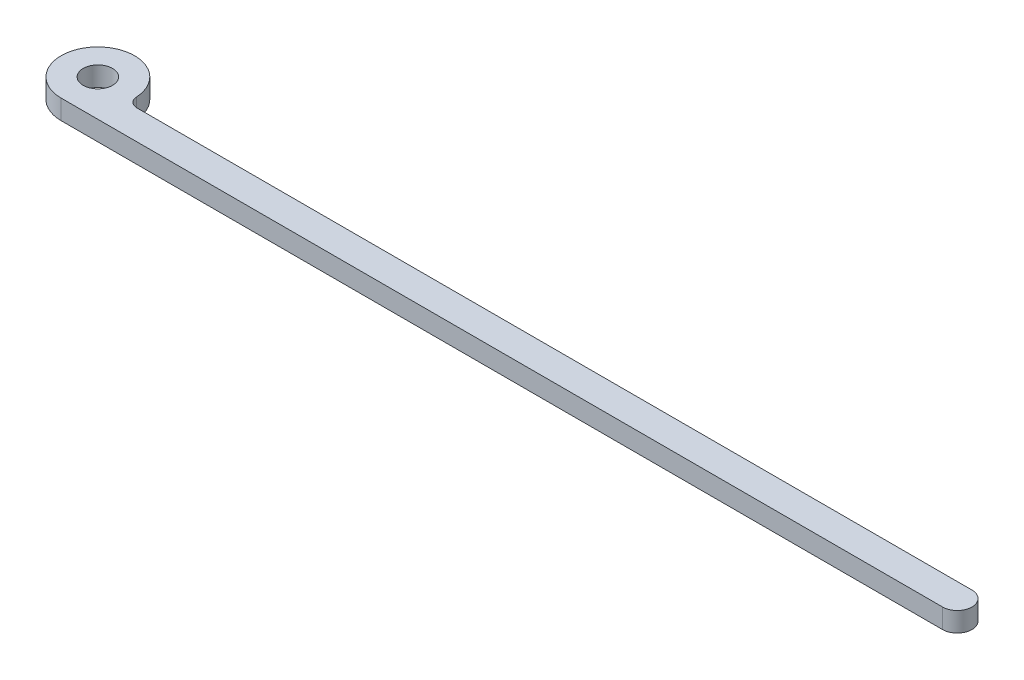
ISO-10303-21;
HEADER;
FILE_DESCRIPTION(('STEP AP214'),'2;1');
FILE_NAME('part.step','',(''),(''),'','','');
FILE_SCHEMA(('AUTOMOTIVE_DESIGN { 1 0 10303 214 1 1 1 1 }'));
ENDSEC;
DATA;
#1=APPLICATION_CONTEXT('core data for automotive mechanical design processes');
#2=APPLICATION_PROTOCOL_DEFINITION('international standard','automotive_design',2000,#1);
#3=PRODUCT_CONTEXT('',#1,'mechanical');
#4=PRODUCT('Part','Part','',(#3));
#5=PRODUCT_RELATED_PRODUCT_CATEGORY('part','',(#4));
#6=PRODUCT_DEFINITION_FORMATION('','',#4);
#7=PRODUCT_DEFINITION_CONTEXT('part definition',#1,'design');
#8=PRODUCT_DEFINITION('design','',#6,#7);
#9=PRODUCT_DEFINITION_SHAPE('','',#8);
#10=(LENGTH_UNIT() NAMED_UNIT(*) SI_UNIT(.MILLI.,.METRE.));
#11=(NAMED_UNIT(*) PLANE_ANGLE_UNIT() SI_UNIT($,.RADIAN.));
#12=(NAMED_UNIT(*) SI_UNIT($,.STERADIAN.) SOLID_ANGLE_UNIT());
#13=UNCERTAINTY_MEASURE_WITH_UNIT(LENGTH_MEASURE(1.E-05),#10,'distance_accuracy_value','');
#14=(GEOMETRIC_REPRESENTATION_CONTEXT(3) GLOBAL_UNCERTAINTY_ASSIGNED_CONTEXT((#13)) GLOBAL_UNIT_ASSIGNED_CONTEXT((#10,
#11,#12)) REPRESENTATION_CONTEXT('',''));
#15=CARTESIAN_POINT('',(0.,0.,0.));
#16=DIRECTION('',(0.,0.,1.));
#17=DIRECTION('',(1.,0.,0.));
#18=AXIS2_PLACEMENT_3D('',#15,#16,#17);
#19=CARTESIAN_POINT('',(0.,2.,0.));
#20=DIRECTION('',(0.,1.,0.));
#21=DIRECTION('',(0.,0.,1.));
#22=AXIS2_PLACEMENT_3D('',#19,#20,#21);
#23=PLANE('',#22);
#24=DIRECTION('',(-1.,0.,0.));
#25=VECTOR('',#24,1.);
#26=CARTESIAN_POINT('',(180.,2.,1.5));
#27=LINE('',#26,#25);
#28=CARTESIAN_POINT('',(180.,2.,1.5));
#29=VERTEX_POINT('',#28);
#30=CARTESIAN_POINT('',(9.48683298050512,2.,1.49999999999994));
#31=VERTEX_POINT('',#30);
#32=EDGE_CURVE('E127',#29,#31,#27,.T.);
#33=ORIENTED_EDGE('',*,*,#32,.T.);
#34=CARTESIAN_POINT('',(9.48683298050513,2.,-0.500000000000062));
#35=DIRECTION('',(0.,1.,0.));
#36=DIRECTION('',(0.,0.,1.));
#37=AXIS2_PLACEMENT_3D('',#34,#35,#36);
#38=CIRCLE('',#37,2.);
#39=CARTESIAN_POINT('',(7.48960498460932,2.,-0.394736842105312));
#40=VERTEX_POINT('',#39);
#41=EDGE_CURVE('E11',#31,#40,#38,.F.);
#42=ORIENTED_EDGE('',*,*,#41,.T.);
#43=CARTESIAN_POINT('',(0.,2.,0.));
#44=DIRECTION('',(0.,1.,0.));
#45=DIRECTION('',(0.,0.,1.));
#46=AXIS2_PLACEMENT_3D('',#43,#44,#45);
#47=CIRCLE('',#46,7.5);
#48=CARTESIAN_POINT('',(0.,2.,7.5));
#49=VERTEX_POINT('',#48);
#50=EDGE_CURVE('E86',#40,#49,#47,.T.);
#51=ORIENTED_EDGE('',*,*,#50,.T.);
#52=DIRECTION('',(1.,0.,0.));
#53=VECTOR('',#52,1.);
#54=CARTESIAN_POINT('',(0.,2.,7.5));
#55=LINE('',#54,#53);
#56=CARTESIAN_POINT('',(180.,2.,7.5));
#57=VERTEX_POINT('',#56);
#58=EDGE_CURVE('E89',#49,#57,#55,.T.);
#59=ORIENTED_EDGE('',*,*,#58,.T.);
#60=CARTESIAN_POINT('',(180.,2.,4.5));
#61=DIRECTION('',(0.,1.,0.));
#62=DIRECTION('',(0.,0.,1.));
#63=AXIS2_PLACEMENT_3D('',#60,#61,#62);
#64=CIRCLE('',#63,3.);
#65=EDGE_CURVE('E107',#57,#29,#64,.T.);
#66=ORIENTED_EDGE('',*,*,#65,.T.);
#67=EDGE_LOOP('',(#33,#42,#51,#59,#66));
#68=FACE_BOUND('',#67,.T.);
#69=CARTESIAN_POINT('',(0.,2.,0.));
#70=DIRECTION('',(0.,1.,0.));
#71=DIRECTION('',(0.,0.,1.));
#72=AXIS2_PLACEMENT_3D('',#69,#70,#71);
#73=CIRCLE('',#72,3.);
#74=CARTESIAN_POINT('',(0.,2.,3.));
#75=VERTEX_POINT('',#74);
#76=EDGE_CURVE('E138',#75,#75,#73,.T.);
#77=ORIENTED_EDGE('',*,*,#76,.F.);
#78=EDGE_LOOP('',(#77));
#79=FACE_BOUND('',#78,.T.);
#80=ADVANCED_FACE('F39',(#68,#79),#23,.T.);
#81=CARTESIAN_POINT('',(0.,-2.,0.));
#82=DIRECTION('',(0.,1.,0.));
#83=DIRECTION('',(0.,0.,1.));
#84=AXIS2_PLACEMENT_3D('',#81,#82,#83);
#85=PLANE('',#84);
#86=CARTESIAN_POINT('',(0.,-2.,0.));
#87=DIRECTION('',(0.,1.,0.));
#88=DIRECTION('',(0.,0.,1.));
#89=AXIS2_PLACEMENT_3D('',#86,#87,#88);
#90=CIRCLE('',#89,7.5);
#91=CARTESIAN_POINT('',(7.48960498460932,-2.,-0.394736842105312));
#92=VERTEX_POINT('',#91);
#93=CARTESIAN_POINT('',(0.,-2.,7.5));
#94=VERTEX_POINT('',#93);
#95=EDGE_CURVE('E110',#92,#94,#90,.T.);
#96=ORIENTED_EDGE('',*,*,#95,.F.);
#97=CARTESIAN_POINT('',(9.48683298050513,-2.,-0.500000000000062));
#98=DIRECTION('',(0.,1.,0.));
#99=DIRECTION('',(0.,0.,1.));
#100=AXIS2_PLACEMENT_3D('',#97,#98,#99);
#101=CIRCLE('',#100,2.);
#102=CARTESIAN_POINT('',(9.48683298050512,-2.,1.49999999999994));
#103=VERTEX_POINT('',#102);
#104=EDGE_CURVE('E48',#92,#103,#101,.T.);
#105=ORIENTED_EDGE('',*,*,#104,.T.);
#106=DIRECTION('',(-1.,0.,0.));
#107=VECTOR('',#106,1.);
#108=CARTESIAN_POINT('',(180.,-2.,1.5));
#109=LINE('',#108,#107);
#110=CARTESIAN_POINT('',(180.,-2.,1.5));
#111=VERTEX_POINT('',#110);
#112=EDGE_CURVE('E97',#111,#103,#109,.T.);
#113=ORIENTED_EDGE('',*,*,#112,.F.);
#114=CARTESIAN_POINT('',(180.,-2.,4.5));
#115=DIRECTION('',(0.,1.,0.));
#116=DIRECTION('',(0.,0.,1.));
#117=AXIS2_PLACEMENT_3D('',#114,#115,#116);
#118=CIRCLE('',#117,3.);
#119=CARTESIAN_POINT('',(180.,-2.,7.5));
#120=VERTEX_POINT('',#119);
#121=EDGE_CURVE('E130',#120,#111,#118,.T.);
#122=ORIENTED_EDGE('',*,*,#121,.F.);
#123=DIRECTION('',(1.,0.,0.));
#124=VECTOR('',#123,1.);
#125=CARTESIAN_POINT('',(0.,-2.,7.5));
#126=LINE('',#125,#124);
#127=EDGE_CURVE('E133',#94,#120,#126,.T.);
#128=ORIENTED_EDGE('',*,*,#127,.F.);
#129=EDGE_LOOP('',(#96,#105,#113,#122,#128));
#130=FACE_BOUND('',#129,.T.);
#131=CARTESIAN_POINT('',(0.,-2.,0.));
#132=DIRECTION('',(0.,1.,0.));
#133=DIRECTION('',(0.,0.,1.));
#134=AXIS2_PLACEMENT_3D('',#131,#132,#133);
#135=CIRCLE('',#134,3.);
#136=CARTESIAN_POINT('',(0.,-2.,3.));
#137=VERTEX_POINT('',#136);
#138=EDGE_CURVE('E143',#137,#137,#135,.T.);
#139=ORIENTED_EDGE('',*,*,#138,.T.);
#140=EDGE_LOOP('',(#139));
#141=FACE_BOUND('',#140,.T.);
#142=ADVANCED_FACE('F154',(#130,#141),#85,.F.);
#143=CARTESIAN_POINT('',(0.,2.,0.));
#144=DIRECTION('',(0.,-1.,0.));
#145=DIRECTION('',(0.,0.,-1.));
#146=AXIS2_PLACEMENT_3D('',#143,#144,#145);
#147=CYLINDRICAL_SURFACE('',#146,7.5);
#148=ORIENTED_EDGE('',*,*,#50,.F.);
#149=DIRECTION('',(0.,-1.,0.));
#150=VECTOR('',#149,1.);
#151=CARTESIAN_POINT('',(7.48960498460932,2.,-0.394736842105312));
#152=LINE('',#151,#150);
#153=EDGE_CURVE('E113',#40,#92,#152,.T.);
#154=ORIENTED_EDGE('',*,*,#153,.T.);
#155=ORIENTED_EDGE('',*,*,#95,.T.);
#156=DIRECTION('',(0.,-1.,0.));
#157=VECTOR('',#156,1.);
#158=CARTESIAN_POINT('',(0.,2.,7.5));
#159=LINE('',#158,#157);
#160=EDGE_CURVE('E102',#49,#94,#159,.T.);
#161=ORIENTED_EDGE('',*,*,#160,.F.);
#162=EDGE_LOOP('',(#148,#154,#155,#161));
#163=FACE_BOUND('',#162,.T.);
#164=ADVANCED_FACE('F109',(#163),#147,.T.);
#165=CARTESIAN_POINT('',(0.,2.,7.5));
#166=DIRECTION('',(0.,0.,-1.));
#167=DIRECTION('',(-1.,0.,0.));
#168=AXIS2_PLACEMENT_3D('',#165,#166,#167);
#169=PLANE('',#168);
#170=ORIENTED_EDGE('',*,*,#127,.T.);
#171=DIRECTION('',(0.,-1.,0.));
#172=VECTOR('',#171,1.);
#173=CARTESIAN_POINT('',(180.,2.,7.5));
#174=LINE('',#173,#172);
#175=EDGE_CURVE('E104',#57,#120,#174,.T.);
#176=ORIENTED_EDGE('',*,*,#175,.F.);
#177=ORIENTED_EDGE('',*,*,#58,.F.);
#178=ORIENTED_EDGE('',*,*,#160,.T.);
#179=EDGE_LOOP('',(#170,#176,#177,#178));
#180=FACE_BOUND('',#179,.T.);
#181=ADVANCED_FACE('F101',(#180),#169,.F.);
#182=CARTESIAN_POINT('',(180.,2.,4.5));
#183=DIRECTION('',(0.,-1.,0.));
#184=DIRECTION('',(0.,0.,-1.));
#185=AXIS2_PLACEMENT_3D('',#182,#183,#184);
#186=CYLINDRICAL_SURFACE('',#185,3.);
#187=ORIENTED_EDGE('',*,*,#121,.T.);
#188=DIRECTION('',(0.,-1.,0.));
#189=VECTOR('',#188,1.);
#190=CARTESIAN_POINT('',(180.,2.,1.5));
#191=LINE('',#190,#189);
#192=EDGE_CURVE('E118',#29,#111,#191,.T.);
#193=ORIENTED_EDGE('',*,*,#192,.F.);
#194=ORIENTED_EDGE('',*,*,#65,.F.);
#195=ORIENTED_EDGE('',*,*,#175,.T.);
#196=EDGE_LOOP('',(#187,#193,#194,#195));
#197=FACE_BOUND('',#196,.T.);
#198=ADVANCED_FACE('F165',(#197),#186,.T.);
#199=CARTESIAN_POINT('',(180.,2.,1.5));
#200=DIRECTION('',(0.,0.,1.));
#201=DIRECTION('',(1.,0.,0.));
#202=AXIS2_PLACEMENT_3D('',#199,#200,#201);
#203=PLANE('',#202);
#204=ORIENTED_EDGE('',*,*,#112,.T.);
#205=DIRECTION('',(0.,1.,0.));
#206=VECTOR('',#205,1.);
#207=CARTESIAN_POINT('',(9.48683298050513,2.,1.49999999999994));
#208=LINE('',#207,#206);
#209=EDGE_CURVE('E55',#103,#31,#208,.T.);
#210=ORIENTED_EDGE('',*,*,#209,.T.);
#211=ORIENTED_EDGE('',*,*,#32,.F.);
#212=ORIENTED_EDGE('',*,*,#192,.T.);
#213=EDGE_LOOP('',(#204,#210,#211,#212));
#214=FACE_BOUND('',#213,.T.);
#215=ADVANCED_FACE('F162',(#214),#203,.F.);
#216=CARTESIAN_POINT('',(0.,2.,0.));
#217=DIRECTION('',(0.,-1.,0.));
#218=DIRECTION('',(0.,0.,-1.));
#219=AXIS2_PLACEMENT_3D('',#216,#217,#218);
#220=CYLINDRICAL_SURFACE('',#219,3.);
#221=ORIENTED_EDGE('',*,*,#76,.T.);
#222=EDGE_LOOP('',(#221));
#223=FACE_BOUND('',#222,.T.);
#224=ORIENTED_EDGE('',*,*,#138,.F.);
#225=EDGE_LOOP('',(#224));
#226=FACE_BOUND('',#225,.T.);
#227=ADVANCED_FACE('F151',(#223,#226),#220,.F.);
#228=CARTESIAN_POINT('',(9.48683298050513,2.,-0.500000000000062));
#229=DIRECTION('',(0.,-1.,0.));
#230=DIRECTION('',(0.,0.,-1.));
#231=AXIS2_PLACEMENT_3D('',#228,#229,#230);
#232=CYLINDRICAL_SURFACE('',#231,2.);
#233=ORIENTED_EDGE('',*,*,#41,.F.);
#234=ORIENTED_EDGE('',*,*,#209,.F.);
#235=ORIENTED_EDGE('',*,*,#104,.F.);
#236=ORIENTED_EDGE('',*,*,#153,.F.);
#237=EDGE_LOOP('',(#233,#234,#235,#236));
#238=FACE_BOUND('',#237,.T.);
#239=ADVANCED_FACE('F41',(#238),#232,.F.);
#240=CLOSED_SHELL('',(#80,#142,#164,#181,#198,#215,#227,#239));
#241=MANIFOLD_SOLID_BREP('B2',#240);
#242=ADVANCED_BREP_SHAPE_REPRESENTATION('',(#18,#241),#14);
#243=SHAPE_DEFINITION_REPRESENTATION(#9,#242);
ENDSEC;
END-ISO-10303-21;
